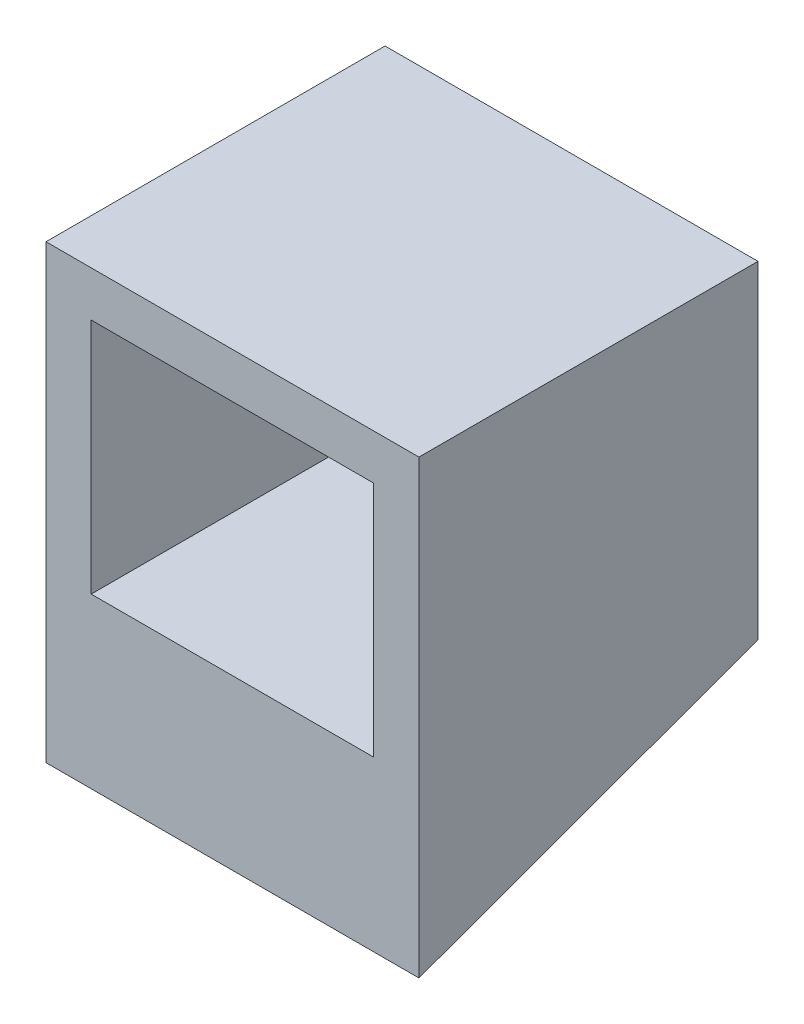
ISO-10303-21;
HEADER;
FILE_DESCRIPTION(('STEP AP214'),'2;1');
FILE_NAME('part.step','',(''),(''),'','','');
FILE_SCHEMA(('AUTOMOTIVE_DESIGN { 1 0 10303 214 1 1 1 1 }'));
ENDSEC;
DATA;
#1=APPLICATION_CONTEXT('core data for automotive mechanical design processes');
#2=APPLICATION_PROTOCOL_DEFINITION('international standard','automotive_design',2000,#1);
#3=PRODUCT_CONTEXT('',#1,'mechanical');
#4=PRODUCT('Part','Part','',(#3));
#5=PRODUCT_RELATED_PRODUCT_CATEGORY('part','',(#4));
#6=PRODUCT_DEFINITION_FORMATION('','',#4);
#7=PRODUCT_DEFINITION_CONTEXT('part definition',#1,'design');
#8=PRODUCT_DEFINITION('design','',#6,#7);
#9=PRODUCT_DEFINITION_SHAPE('','',#8);
#10=(LENGTH_UNIT() NAMED_UNIT(*) SI_UNIT(.MILLI.,.METRE.));
#11=(NAMED_UNIT(*) PLANE_ANGLE_UNIT() SI_UNIT($,.RADIAN.));
#12=(NAMED_UNIT(*) SI_UNIT($,.STERADIAN.) SOLID_ANGLE_UNIT());
#13=UNCERTAINTY_MEASURE_WITH_UNIT(LENGTH_MEASURE(1.E-05),#10,'distance_accuracy_value','');
#14=(GEOMETRIC_REPRESENTATION_CONTEXT(3) GLOBAL_UNCERTAINTY_ASSIGNED_CONTEXT((#13)) GLOBAL_UNIT_ASSIGNED_CONTEXT((#10,
#11,#12)) REPRESENTATION_CONTEXT('',''));
#15=CARTESIAN_POINT('',(0.,0.,0.));
#16=DIRECTION('',(0.,0.,1.));
#17=DIRECTION('',(1.,0.,0.));
#18=AXIS2_PLACEMENT_3D('',#15,#16,#17);
#19=CARTESIAN_POINT('',(0.,0.,15.));
#20=DIRECTION('',(0.,0.,-1.));
#21=DIRECTION('',(-1.,0.,0.));
#22=AXIS2_PLACEMENT_3D('',#19,#20,#21);
#23=PLANE('',#22);
#24=DIRECTION('',(-1.,0.,0.));
#25=VECTOR('',#24,1.);
#26=CARTESIAN_POINT('',(-2.,2.,15.));
#27=LINE('',#26,#25);
#28=CARTESIAN_POINT('',(14.5,2.,15.));
#29=VERTEX_POINT('',#28);
#30=CARTESIAN_POINT('',(-2.,2.,15.));
#31=VERTEX_POINT('',#30);
#32=EDGE_CURVE('E157',#29,#31,#27,.T.);
#33=ORIENTED_EDGE('',*,*,#32,.T.);
#34=DIRECTION('',(0.,-1.,0.));
#35=VECTOR('',#34,1.);
#36=CARTESIAN_POINT('',(-2.,2.,15.));
#37=LINE('',#36,#35);
#38=CARTESIAN_POINT('',(-2.,-17.9595535139929,15.));
#39=VERTEX_POINT('',#38);
#40=EDGE_CURVE('E115',#31,#39,#37,.T.);
#41=ORIENTED_EDGE('',*,*,#40,.T.);
#42=DIRECTION('',(-1.,0.,0.));
#43=VECTOR('',#42,1.);
#44=CARTESIAN_POINT('',(14.5,-17.9595535139929,15.));
#45=LINE('',#44,#43);
#46=CARTESIAN_POINT('',(14.5,-17.9595535139929,15.));
#47=VERTEX_POINT('',#46);
#48=EDGE_CURVE('E118',#47,#39,#45,.T.);
#49=ORIENTED_EDGE('',*,*,#48,.F.);
#50=DIRECTION('',(0.,1.,0.));
#51=VECTOR('',#50,1.);
#52=CARTESIAN_POINT('',(14.5,2.,15.));
#53=LINE('',#52,#51);
#54=EDGE_CURVE('E106',#47,#29,#53,.T.);
#55=ORIENTED_EDGE('',*,*,#54,.T.);
#56=EDGE_LOOP('',(#33,#41,#49,#55));
#57=FACE_BOUND('',#56,.T.);
#58=DIRECTION('',(0.,-1.,0.));
#59=VECTOR('',#58,1.);
#60=CARTESIAN_POINT('',(0.,0.,15.));
#61=LINE('',#60,#59);
#62=CARTESIAN_POINT('',(0.,0.,15.));
#63=VERTEX_POINT('',#62);
#64=CARTESIAN_POINT('',(0.,-10.5,15.));
#65=VERTEX_POINT('',#64);
#66=EDGE_CURVE('E131',#63,#65,#61,.T.);
#67=ORIENTED_EDGE('',*,*,#66,.F.);
#68=DIRECTION('',(-1.,0.,0.));
#69=VECTOR('',#68,1.);
#70=CARTESIAN_POINT('',(0.,0.,15.));
#71=LINE('',#70,#69);
#72=CARTESIAN_POINT('',(12.5,0.,15.));
#73=VERTEX_POINT('',#72);
#74=EDGE_CURVE('E138',#73,#63,#71,.T.);
#75=ORIENTED_EDGE('',*,*,#74,.F.);
#76=DIRECTION('',(0.,1.,0.));
#77=VECTOR('',#76,1.);
#78=CARTESIAN_POINT('',(12.5,0.,15.));
#79=LINE('',#78,#77);
#80=CARTESIAN_POINT('',(12.5,-10.5,15.));
#81=VERTEX_POINT('',#80);
#82=EDGE_CURVE('E136',#81,#73,#79,.T.);
#83=ORIENTED_EDGE('',*,*,#82,.F.);
#84=DIRECTION('',(1.,0.,0.));
#85=VECTOR('',#84,1.);
#86=CARTESIAN_POINT('',(0.,-10.5,15.));
#87=LINE('',#86,#85);
#88=EDGE_CURVE('E133',#65,#81,#87,.T.);
#89=ORIENTED_EDGE('',*,*,#88,.F.);
#90=EDGE_LOOP('',(#67,#75,#83,#89));
#91=FACE_BOUND('',#90,.T.);
#92=ADVANCED_FACE('F39',(#57,#91),#23,.F.);
#93=CARTESIAN_POINT('',(0.,0.,0.));
#94=DIRECTION('',(0.,0.,-1.));
#95=DIRECTION('',(-1.,0.,0.));
#96=AXIS2_PLACEMENT_3D('',#93,#94,#95);
#97=PLANE('',#96);
#98=DIRECTION('',(-1.,0.,0.));
#99=VECTOR('',#98,1.);
#100=CARTESIAN_POINT('',(-2.,2.,0.));
#101=LINE('',#100,#99);
#102=CARTESIAN_POINT('',(14.5,2.,0.));
#103=VERTEX_POINT('',#102);
#104=CARTESIAN_POINT('',(-2.,2.,0.));
#105=VERTEX_POINT('',#104);
#106=EDGE_CURVE('E156',#103,#105,#101,.T.);
#107=ORIENTED_EDGE('',*,*,#106,.F.);
#108=DIRECTION('',(0.,1.,0.));
#109=VECTOR('',#108,1.);
#110=CARTESIAN_POINT('',(14.5,2.,0.));
#111=LINE('',#110,#109);
#112=CARTESIAN_POINT('',(14.5,-12.5,0.));
#113=VERTEX_POINT('',#112);
#114=EDGE_CURVE('E159',#113,#103,#111,.T.);
#115=ORIENTED_EDGE('',*,*,#114,.F.);
#116=DIRECTION('',(1.,0.,0.));
#117=VECTOR('',#116,1.);
#118=CARTESIAN_POINT('',(-2.,-12.5,0.));
#119=LINE('',#118,#117);
#120=CARTESIAN_POINT('',(-2.,-12.5,0.));
#121=VERTEX_POINT('',#120);
#122=EDGE_CURVE('E126',#121,#113,#119,.T.);
#123=ORIENTED_EDGE('',*,*,#122,.F.);
#124=DIRECTION('',(0.,-1.,0.));
#125=VECTOR('',#124,1.);
#126=CARTESIAN_POINT('',(-2.,2.,0.));
#127=LINE('',#126,#125);
#128=EDGE_CURVE('E163',#105,#121,#127,.T.);
#129=ORIENTED_EDGE('',*,*,#128,.F.);
#130=EDGE_LOOP('',(#107,#115,#123,#129));
#131=FACE_BOUND('',#130,.T.);
#132=DIRECTION('',(-1.,0.,0.));
#133=VECTOR('',#132,1.);
#134=CARTESIAN_POINT('',(0.,0.,0.));
#135=LINE('',#134,#133);
#136=CARTESIAN_POINT('',(12.5,0.,0.));
#137=VERTEX_POINT('',#136);
#138=CARTESIAN_POINT('',(0.,0.,0.));
#139=VERTEX_POINT('',#138);
#140=EDGE_CURVE('E134',#137,#139,#135,.T.);
#141=ORIENTED_EDGE('',*,*,#140,.T.);
#142=DIRECTION('',(0.,-1.,0.));
#143=VECTOR('',#142,1.);
#144=CARTESIAN_POINT('',(0.,0.,0.));
#145=LINE('',#144,#143);
#146=CARTESIAN_POINT('',(0.,-10.5,0.));
#147=VERTEX_POINT('',#146);
#148=EDGE_CURVE('E62',#139,#147,#145,.T.);
#149=ORIENTED_EDGE('',*,*,#148,.T.);
#150=DIRECTION('',(1.,0.,0.));
#151=VECTOR('',#150,1.);
#152=CARTESIAN_POINT('',(0.,-10.5,0.));
#153=LINE('',#152,#151);
#154=CARTESIAN_POINT('',(12.5,-10.5,0.));
#155=VERTEX_POINT('',#154);
#156=EDGE_CURVE('E142',#147,#155,#153,.T.);
#157=ORIENTED_EDGE('',*,*,#156,.T.);
#158=DIRECTION('',(0.,1.,0.));
#159=VECTOR('',#158,1.);
#160=CARTESIAN_POINT('',(12.5,0.,0.));
#161=LINE('',#160,#159);
#162=EDGE_CURVE('E145',#155,#137,#161,.T.);
#163=ORIENTED_EDGE('',*,*,#162,.T.);
#164=EDGE_LOOP('',(#141,#149,#157,#163));
#165=FACE_BOUND('',#164,.T.);
#166=ADVANCED_FACE('F171',(#131,#165),#97,.T.);
#167=CARTESIAN_POINT('',(-2.,2.,15.));
#168=DIRECTION('',(0.,-1.,0.));
#169=DIRECTION('',(0.,0.,-1.));
#170=AXIS2_PLACEMENT_3D('',#167,#168,#169);
#171=PLANE('',#170);
#172=ORIENTED_EDGE('',*,*,#106,.T.);
#173=DIRECTION('',(0.,0.,-1.));
#174=VECTOR('',#173,1.);
#175=CARTESIAN_POINT('',(-2.,2.,15.));
#176=LINE('',#175,#174);
#177=EDGE_CURVE('E11',#31,#105,#176,.T.);
#178=ORIENTED_EDGE('',*,*,#177,.F.);
#179=ORIENTED_EDGE('',*,*,#32,.F.);
#180=DIRECTION('',(0.,0.,-1.));
#181=VECTOR('',#180,1.);
#182=CARTESIAN_POINT('',(14.5,2.,15.));
#183=LINE('',#182,#181);
#184=EDGE_CURVE('E47',#29,#103,#183,.T.);
#185=ORIENTED_EDGE('',*,*,#184,.T.);
#186=EDGE_LOOP('',(#172,#178,#179,#185));
#187=FACE_BOUND('',#186,.T.);
#188=ADVANCED_FACE('F41',(#187),#171,.F.);
#189=CARTESIAN_POINT('',(-2.,2.,15.));
#190=DIRECTION('',(1.,0.,0.));
#191=DIRECTION('',(0.,0.,-1.));
#192=AXIS2_PLACEMENT_3D('',#189,#190,#191);
#193=PLANE('',#192);
#194=ORIENTED_EDGE('',*,*,#128,.T.);
#195=DIRECTION('',(0.,-0.342020143325663,0.939692620785911));
#196=VECTOR('',#195,1.);
#197=CARTESIAN_POINT('',(-2.,-12.5,0.));
#198=LINE('',#197,#196);
#199=EDGE_CURVE('E127',#121,#39,#198,.T.);
#200=ORIENTED_EDGE('',*,*,#199,.T.);
#201=ORIENTED_EDGE('',*,*,#40,.F.);
#202=ORIENTED_EDGE('',*,*,#177,.T.);
#203=EDGE_LOOP('',(#194,#200,#201,#202));
#204=FACE_BOUND('',#203,.T.);
#205=ADVANCED_FACE('F174',(#204),#193,.F.);
#206=CARTESIAN_POINT('',(14.5,2.,15.));
#207=DIRECTION('',(-1.,0.,0.));
#208=DIRECTION('',(0.,0.,1.));
#209=AXIS2_PLACEMENT_3D('',#206,#207,#208);
#210=PLANE('',#209);
#211=ORIENTED_EDGE('',*,*,#114,.T.);
#212=ORIENTED_EDGE('',*,*,#184,.F.);
#213=ORIENTED_EDGE('',*,*,#54,.F.);
#214=DIRECTION('',(0.,-0.342020143325663,0.939692620785911));
#215=VECTOR('',#214,1.);
#216=CARTESIAN_POINT('',(14.5,-12.5,0.));
#217=LINE('',#216,#215);
#218=EDGE_CURVE('E110',#113,#47,#217,.T.);
#219=ORIENTED_EDGE('',*,*,#218,.F.);
#220=EDGE_LOOP('',(#211,#212,#213,#219));
#221=FACE_BOUND('',#220,.T.);
#222=ADVANCED_FACE('F108',(#221),#210,.F.);
#223=CARTESIAN_POINT('',(0.,0.,15.));
#224=DIRECTION('',(1.,0.,0.));
#225=DIRECTION('',(0.,1.,0.));
#226=AXIS2_PLACEMENT_3D('',#223,#224,#225);
#227=PLANE('',#226);
#228=ORIENTED_EDGE('',*,*,#148,.F.);
#229=DIRECTION('',(0.,0.,-1.));
#230=VECTOR('',#229,1.);
#231=CARTESIAN_POINT('',(0.,0.,15.));
#232=LINE('',#231,#230);
#233=EDGE_CURVE('E140',#63,#139,#232,.T.);
#234=ORIENTED_EDGE('',*,*,#233,.F.);
#235=ORIENTED_EDGE('',*,*,#66,.T.);
#236=DIRECTION('',(0.,0.,-1.));
#237=VECTOR('',#236,1.);
#238=CARTESIAN_POINT('',(0.,-10.5,15.));
#239=LINE('',#238,#237);
#240=EDGE_CURVE('E154',#65,#147,#239,.T.);
#241=ORIENTED_EDGE('',*,*,#240,.T.);
#242=EDGE_LOOP('',(#228,#234,#235,#241));
#243=FACE_BOUND('',#242,.T.);
#244=ADVANCED_FACE('F180',(#243),#227,.T.);
#245=CARTESIAN_POINT('',(0.,-10.5,15.));
#246=DIRECTION('',(0.,1.,0.));
#247=DIRECTION('',(0.,0.,1.));
#248=AXIS2_PLACEMENT_3D('',#245,#246,#247);
#249=PLANE('',#248);
#250=ORIENTED_EDGE('',*,*,#156,.F.);
#251=ORIENTED_EDGE('',*,*,#240,.F.);
#252=ORIENTED_EDGE('',*,*,#88,.T.);
#253=DIRECTION('',(0.,0.,-1.));
#254=VECTOR('',#253,1.);
#255=CARTESIAN_POINT('',(12.5,-10.5,15.));
#256=LINE('',#255,#254);
#257=EDGE_CURVE('E152',#81,#155,#256,.T.);
#258=ORIENTED_EDGE('',*,*,#257,.T.);
#259=EDGE_LOOP('',(#250,#251,#252,#258));
#260=FACE_BOUND('',#259,.T.);
#261=ADVANCED_FACE('F191',(#260),#249,.T.);
#262=CARTESIAN_POINT('',(12.5,0.,15.));
#263=DIRECTION('',(-1.,0.,0.));
#264=DIRECTION('',(0.,-1.,0.));
#265=AXIS2_PLACEMENT_3D('',#262,#263,#264);
#266=PLANE('',#265);
#267=ORIENTED_EDGE('',*,*,#162,.F.);
#268=ORIENTED_EDGE('',*,*,#257,.F.);
#269=ORIENTED_EDGE('',*,*,#82,.T.);
#270=DIRECTION('',(0.,0.,-1.));
#271=VECTOR('',#270,1.);
#272=CARTESIAN_POINT('',(12.5,0.,15.));
#273=LINE('',#272,#271);
#274=EDGE_CURVE('E54',#73,#137,#273,.T.);
#275=ORIENTED_EDGE('',*,*,#274,.T.);
#276=EDGE_LOOP('',(#267,#268,#269,#275));
#277=FACE_BOUND('',#276,.T.);
#278=ADVANCED_FACE('F194',(#277),#266,.T.);
#279=CARTESIAN_POINT('',(0.,0.,15.));
#280=DIRECTION('',(0.,-1.,0.));
#281=DIRECTION('',(0.,0.,-1.));
#282=AXIS2_PLACEMENT_3D('',#279,#280,#281);
#283=PLANE('',#282);
#284=ORIENTED_EDGE('',*,*,#140,.F.);
#285=ORIENTED_EDGE('',*,*,#274,.F.);
#286=ORIENTED_EDGE('',*,*,#74,.T.);
#287=ORIENTED_EDGE('',*,*,#233,.T.);
#288=EDGE_LOOP('',(#284,#285,#286,#287));
#289=FACE_BOUND('',#288,.T.);
#290=ADVANCED_FACE('F198',(#289),#283,.T.);
#291=CARTESIAN_POINT('',(14.5,-12.5,0.));
#292=DIRECTION('',(0.,-0.93969262078591,-0.342020143325663));
#293=DIRECTION('',(0.,0.342020143325663,-0.939692620785911));
#294=AXIS2_PLACEMENT_3D('',#291,#292,#293);
#295=PLANE('',#294);
#296=ORIENTED_EDGE('',*,*,#199,.F.);
#297=ORIENTED_EDGE('',*,*,#122,.T.);
#298=ORIENTED_EDGE('',*,*,#218,.T.);
#299=ORIENTED_EDGE('',*,*,#48,.T.);
#300=EDGE_LOOP('',(#296,#297,#298,#299));
#301=FACE_BOUND('',#300,.T.);
#302=ADVANCED_FACE('F125',(#301),#295,.T.);
#303=CLOSED_SHELL('',(#92,#166,#188,#205,#222,#244,#261,#278,#290,#302));
#304=MANIFOLD_SOLID_BREP('B2',#303);
#305=ADVANCED_BREP_SHAPE_REPRESENTATION('',(#18,#304),#14);
#306=SHAPE_DEFINITION_REPRESENTATION(#9,#305);
ENDSEC;
END-ISO-10303-21;
